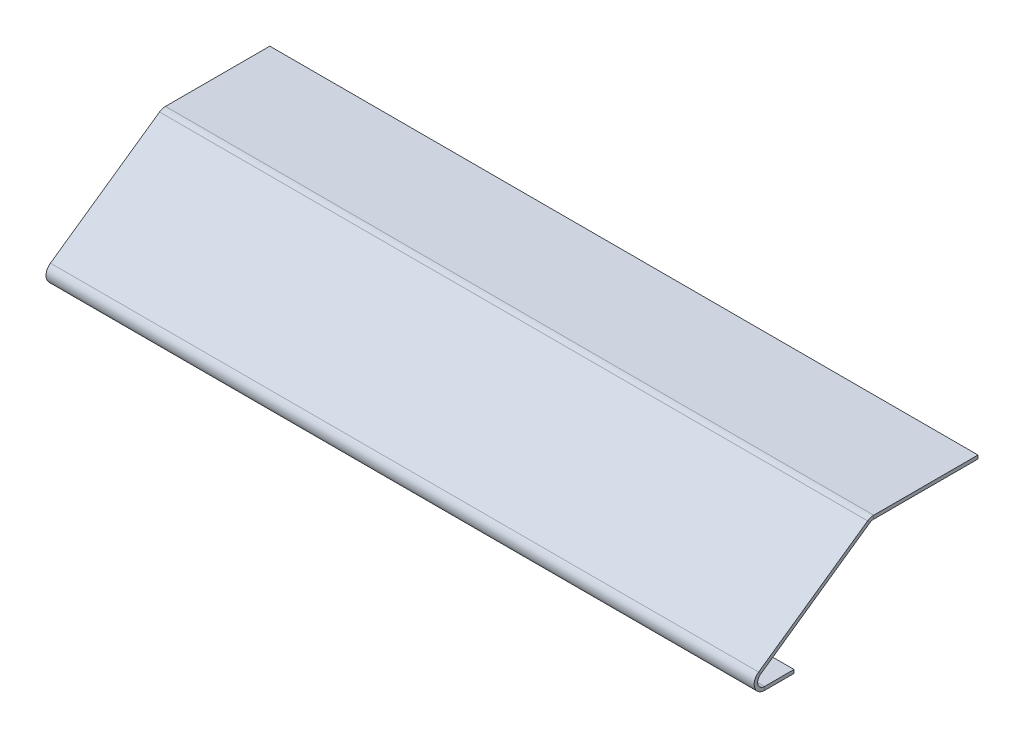
ISO-10303-21;
HEADER;
FILE_DESCRIPTION(('STEP AP214'),'2;1');
FILE_NAME('part.step','',(''),(''),'','','');
FILE_SCHEMA(('AUTOMOTIVE_DESIGN { 1 0 10303 214 1 1 1 1 }'));
ENDSEC;
DATA;
#1=APPLICATION_CONTEXT('core data for automotive mechanical design processes');
#2=APPLICATION_PROTOCOL_DEFINITION('international standard','automotive_design',2000,#1);
#3=PRODUCT_CONTEXT('',#1,'mechanical');
#4=PRODUCT('Part','Part','',(#3));
#5=PRODUCT_RELATED_PRODUCT_CATEGORY('part','',(#4));
#6=PRODUCT_DEFINITION_FORMATION('','',#4);
#7=PRODUCT_DEFINITION_CONTEXT('part definition',#1,'design');
#8=PRODUCT_DEFINITION('design','',#6,#7);
#9=PRODUCT_DEFINITION_SHAPE('','',#8);
#10=(LENGTH_UNIT() NAMED_UNIT(*) SI_UNIT(.MILLI.,.METRE.));
#11=(NAMED_UNIT(*) PLANE_ANGLE_UNIT() SI_UNIT($,.RADIAN.));
#12=(NAMED_UNIT(*) SI_UNIT($,.STERADIAN.) SOLID_ANGLE_UNIT());
#13=UNCERTAINTY_MEASURE_WITH_UNIT(LENGTH_MEASURE(1.E-05),#10,'distance_accuracy_value','');
#14=(GEOMETRIC_REPRESENTATION_CONTEXT(3) GLOBAL_UNCERTAINTY_ASSIGNED_CONTEXT((#13)) GLOBAL_UNIT_ASSIGNED_CONTEXT((#10,
#11,#12)) REPRESENTATION_CONTEXT('',''));
#15=CARTESIAN_POINT('',(0.,0.,0.));
#16=DIRECTION('',(0.,0.,1.));
#17=DIRECTION('',(1.,0.,0.));
#18=AXIS2_PLACEMENT_3D('',#15,#16,#17);
#19=CARTESIAN_POINT('',(647.7,17.3274232218526,32.3662327717342));
#20=DIRECTION('',(1.,0.,0.));
#21=DIRECTION('',(0.,0.,-1.));
#22=AXIS2_PLACEMENT_3D('',#19,#20,#21);
#23=PLANE('',#22);
#24=DIRECTION('',(0.,-0.819152044288989,-0.57357643635105));
#25=VECTOR('',#24,1.);
#26=CARTESIAN_POINT('',(647.7,17.3274232218526,32.3662327717342));
#27=LINE('',#26,#25);
#28=CARTESIAN_POINT('',(647.7,17.3274232218526,32.3662327717342));
#29=VERTEX_POINT('',#28);
#30=CARTESIAN_POINT('',(647.7,14.7266154812351,30.5451275863196));
#31=VERTEX_POINT('',#30);
#32=EDGE_CURVE('E11',#29,#31,#27,.T.);
#33=ORIENTED_EDGE('',*,*,#32,.F.);
#34=CARTESIAN_POINT('',(647.7,9.52500000000001,26.9029172154904));
#35=DIRECTION('',(1.,0.,0.));
#36=DIRECTION('',(0.,0.,-1.));
#37=AXIS2_PLACEMENT_3D('',#34,#35,#36);
#38=CIRCLE('',#37,9.525);
#39=CARTESIAN_POINT('',(647.7,0.,26.9029172154904));
#40=VERTEX_POINT('',#39);
#41=EDGE_CURVE('E246',#40,#29,#38,.F.);
#42=ORIENTED_EDGE('',*,*,#41,.F.);
#43=DIRECTION('',(0.,-1.,0.));
#44=VECTOR('',#43,1.);
#45=CARTESIAN_POINT('',(647.7,3.17500000000001,26.9029172154904));
#46=LINE('',#45,#44);
#47=CARTESIAN_POINT('',(647.7,3.17500000000001,26.9029172154904));
#48=VERTEX_POINT('',#47);
#49=EDGE_CURVE('E44',#48,#40,#46,.T.);
#50=ORIENTED_EDGE('',*,*,#49,.F.);
#51=CARTESIAN_POINT('',(647.7,9.52500000000001,26.9029172154904));
#52=DIRECTION('',(1.,0.,0.));
#53=DIRECTION('',(0.,0.,-1.));
#54=AXIS2_PLACEMENT_3D('',#51,#52,#53);
#55=CIRCLE('',#54,6.35);
#56=EDGE_CURVE('E145',#48,#31,#55,.F.);
#57=ORIENTED_EDGE('',*,*,#56,.T.);
#58=EDGE_LOOP('',(#33,#42,#50,#57));
#59=FACE_BOUND('',#58,.T.);
#60=ADVANCED_FACE('F36',(#59),#23,.T.);
#61=CARTESIAN_POINT('',(647.7,3.17500000000001,26.9029172154904));
#62=DIRECTION('',(1.,0.,0.));
#63=DIRECTION('',(0.,0.,-1.));
#64=AXIS2_PLACEMENT_3D('',#61,#62,#63);
#65=PLANE('',#64);
#66=DIRECTION('',(0.,0.573576436351047,-0.819152044288991));
#67=VECTOR('',#66,1.);
#68=CARTESIAN_POINT('',(647.7,0.,57.112357708));
#69=LINE('',#68,#67);
#70=CARTESIAN_POINT('',(647.7,87.1774232218525,-67.3899054992022));
#71=VERTEX_POINT('',#70);
#72=EDGE_CURVE('E139',#29,#71,#69,.T.);
#73=ORIENTED_EDGE('',*,*,#72,.F.);
#74=ORIENTED_EDGE('',*,*,#32,.T.);
#75=DIRECTION('',(0.,0.573576436351047,-0.819152044288991));
#76=VECTOR('',#75,1.);
#77=CARTESIAN_POINT('',(647.7,-2.60080774061755,55.2912525225854));
#78=LINE('',#77,#76);
#79=CARTESIAN_POINT('',(647.7,84.576615481235,-69.2110106846167));
#80=VERTEX_POINT('',#79);
#81=EDGE_CURVE('E136',#31,#80,#78,.T.);
#82=ORIENTED_EDGE('',*,*,#81,.T.);
#83=DIRECTION('',(0.,0.819152044288986,0.573576436351054));
#84=VECTOR('',#83,1.);
#85=CARTESIAN_POINT('',(647.7,84.576615481235,-69.2110106846167));
#86=LINE('',#85,#84);
#87=EDGE_CURVE('E227',#80,#71,#86,.T.);
#88=ORIENTED_EDGE('',*,*,#87,.T.);
#89=EDGE_LOOP('',(#73,#74,#82,#88));
#90=FACE_BOUND('',#89,.T.);
#91=ADVANCED_FACE('F134',(#90),#65,.T.);
#92=CARTESIAN_POINT('',(0.,0.,26.9029172154904));
#93=DIRECTION('',(-1.,0.,0.));
#94=DIRECTION('',(0.,0.,1.));
#95=AXIS2_PLACEMENT_3D('',#92,#93,#94);
#96=PLANE('',#95);
#97=DIRECTION('',(0.,1.,0.));
#98=VECTOR('',#97,1.);
#99=CARTESIAN_POINT('',(0.,0.,26.9029172154904));
#100=LINE('',#99,#98);
#101=CARTESIAN_POINT('',(0.,0.,26.9029172154904));
#102=VERTEX_POINT('',#101);
#103=CARTESIAN_POINT('',(0.,3.17500000000001,26.9029172154904));
#104=VERTEX_POINT('',#103);
#105=EDGE_CURVE('E232',#102,#104,#100,.T.);
#106=ORIENTED_EDGE('',*,*,#105,.F.);
#107=CARTESIAN_POINT('',(0.,9.52500000000001,26.9029172154904));
#108=DIRECTION('',(1.,0.,0.));
#109=DIRECTION('',(0.,0.,-1.));
#110=AXIS2_PLACEMENT_3D('',#107,#108,#109);
#111=CIRCLE('',#110,9.525);
#112=CARTESIAN_POINT('',(0.,17.3274232218526,32.3662327717342));
#113=VERTEX_POINT('',#112);
#114=EDGE_CURVE('E184',#102,#113,#111,.F.);
#115=ORIENTED_EDGE('',*,*,#114,.T.);
#116=DIRECTION('',(0.,0.819152044288989,0.57357643635105));
#117=VECTOR('',#116,1.);
#118=CARTESIAN_POINT('',(0.,14.7266154812351,30.5451275863196));
#119=LINE('',#118,#117);
#120=CARTESIAN_POINT('',(0.,14.7266154812351,30.5451275863196));
#121=VERTEX_POINT('',#120);
#122=EDGE_CURVE('E230',#121,#113,#119,.T.);
#123=ORIENTED_EDGE('',*,*,#122,.F.);
#124=CARTESIAN_POINT('',(0.,9.52500000000001,26.9029172154904));
#125=DIRECTION('',(1.,0.,0.));
#126=DIRECTION('',(0.,0.,-1.));
#127=AXIS2_PLACEMENT_3D('',#124,#125,#126);
#128=CIRCLE('',#127,6.35);
#129=EDGE_CURVE('E157',#104,#121,#128,.F.);
#130=ORIENTED_EDGE('',*,*,#129,.F.);
#131=EDGE_LOOP('',(#106,#115,#123,#130));
#132=FACE_BOUND('',#131,.T.);
#133=ADVANCED_FACE('F284',(#132),#96,.T.);
#134=CARTESIAN_POINT('',(0.,14.7266154812351,30.5451275863196));
#135=DIRECTION('',(-1.,0.,0.));
#136=DIRECTION('',(0.,0.,1.));
#137=AXIS2_PLACEMENT_3D('',#134,#135,#136);
#138=PLANE('',#137);
#139=DIRECTION('',(0.,0.,1.));
#140=VECTOR('',#139,1.);
#141=CARTESIAN_POINT('',(0.,0.,0.));
#142=LINE('',#141,#140);
#143=CARTESIAN_POINT('',(0.,0.,0.));
#144=VERTEX_POINT('',#143);
#145=EDGE_CURVE('E187',#144,#102,#142,.T.);
#146=ORIENTED_EDGE('',*,*,#145,.T.);
#147=ORIENTED_EDGE('',*,*,#105,.T.);
#148=DIRECTION('',(0.,0.,1.));
#149=VECTOR('',#148,1.);
#150=CARTESIAN_POINT('',(0.,3.175,0.));
#151=LINE('',#150,#149);
#152=CARTESIAN_POINT('',(0.,3.175,0.));
#153=VERTEX_POINT('',#152);
#154=EDGE_CURVE('E193',#153,#104,#151,.T.);
#155=ORIENTED_EDGE('',*,*,#154,.F.);
#156=DIRECTION('',(0.,-1.,0.));
#157=VECTOR('',#156,1.);
#158=CARTESIAN_POINT('',(0.,3.175,0.));
#159=LINE('',#158,#157);
#160=EDGE_CURVE('E190',#153,#144,#159,.T.);
#161=ORIENTED_EDGE('',*,*,#160,.T.);
#162=EDGE_LOOP('',(#146,#147,#155,#161));
#163=FACE_BOUND('',#162,.T.);
#164=ADVANCED_FACE('F287',(#163),#138,.T.);
#165=CARTESIAN_POINT('',(647.7,88.9,-72.8532210554459));
#166=DIRECTION('',(1.,0.,0.));
#167=DIRECTION('',(0.,0.,-1.));
#168=AXIS2_PLACEMENT_3D('',#165,#166,#167);
#169=PLANE('',#168);
#170=DIRECTION('',(0.,-1.,0.));
#171=VECTOR('',#170,1.);
#172=CARTESIAN_POINT('',(647.7,88.9,-72.8532210554459));
#173=LINE('',#172,#171);
#174=CARTESIAN_POINT('',(647.7,88.9,-72.8532210554459));
#175=VERTEX_POINT('',#174);
#176=CARTESIAN_POINT('',(647.7,85.725,-72.8532210554459));
#177=VERTEX_POINT('',#176);
#178=EDGE_CURVE('E52',#175,#177,#173,.T.);
#179=ORIENTED_EDGE('',*,*,#178,.F.);
#180=CARTESIAN_POINT('',(647.7,79.375,-72.8532210554459));
#181=DIRECTION('',(1.,0.,0.));
#182=DIRECTION('',(0.,0.,-1.));
#183=AXIS2_PLACEMENT_3D('',#180,#181,#182);
#184=CIRCLE('',#183,9.525);
#185=EDGE_CURVE('E256',#71,#175,#184,.F.);
#186=ORIENTED_EDGE('',*,*,#185,.F.);
#187=ORIENTED_EDGE('',*,*,#87,.F.);
#188=CARTESIAN_POINT('',(647.7,79.375,-72.8532210554459));
#189=DIRECTION('',(1.,0.,0.));
#190=DIRECTION('',(0.,0.,-1.));
#191=AXIS2_PLACEMENT_3D('',#188,#189,#190);
#192=CIRCLE('',#191,6.35);
#193=EDGE_CURVE('E165',#80,#177,#192,.F.);
#194=ORIENTED_EDGE('',*,*,#193,.T.);
#195=EDGE_LOOP('',(#179,#186,#187,#194));
#196=FACE_BOUND('',#195,.T.);
#197=ADVANCED_FACE('F279',(#196),#169,.T.);
#198=CARTESIAN_POINT('',(647.7,84.576615481235,-69.2110106846167));
#199=DIRECTION('',(1.,0.,0.));
#200=DIRECTION('',(0.,0.,-1.));
#201=AXIS2_PLACEMENT_3D('',#198,#199,#200);
#202=PLANE('',#201);
#203=DIRECTION('',(0.,0.,-1.));
#204=VECTOR('',#203,1.);
#205=CARTESIAN_POINT('',(647.7,88.9,-69.8500000913737));
#206=LINE('',#205,#204);
#207=CARTESIAN_POINT('',(647.7,88.9,-168.275000091374));
#208=VERTEX_POINT('',#207);
#209=EDGE_CURVE('E259',#175,#208,#206,.T.);
#210=ORIENTED_EDGE('',*,*,#209,.F.);
#211=ORIENTED_EDGE('',*,*,#178,.T.);
#212=DIRECTION('',(0.,0.,-1.));
#213=VECTOR('',#212,1.);
#214=CARTESIAN_POINT('',(647.7,85.725,-69.8500000913737));
#215=LINE('',#214,#213);
#216=CARTESIAN_POINT('',(647.7,85.725,-168.275000091374));
#217=VERTEX_POINT('',#216);
#218=EDGE_CURVE('E106',#177,#217,#215,.T.);
#219=ORIENTED_EDGE('',*,*,#218,.T.);
#220=DIRECTION('',(0.,-1.,0.));
#221=VECTOR('',#220,1.);
#222=CARTESIAN_POINT('',(647.7,88.9,-168.275000091374));
#223=LINE('',#222,#221);
#224=EDGE_CURVE('E262',#208,#217,#223,.T.);
#225=ORIENTED_EDGE('',*,*,#224,.F.);
#226=EDGE_LOOP('',(#210,#211,#219,#225));
#227=FACE_BOUND('',#226,.T.);
#228=ADVANCED_FACE('F268',(#227),#202,.T.);
#229=CARTESIAN_POINT('',(0.,87.1774232218525,-67.3899054992022));
#230=DIRECTION('',(-1.,0.,0.));
#231=DIRECTION('',(0.,0.,1.));
#232=AXIS2_PLACEMENT_3D('',#229,#230,#231);
#233=PLANE('',#232);
#234=DIRECTION('',(0.,-0.819152044288986,-0.573576436351054));
#235=VECTOR('',#234,1.);
#236=CARTESIAN_POINT('',(0.,87.1774232218525,-67.3899054992022));
#237=LINE('',#236,#235);
#238=CARTESIAN_POINT('',(0.,87.1774232218525,-67.3899054992022));
#239=VERTEX_POINT('',#238);
#240=CARTESIAN_POINT('',(0.,84.576615481235,-69.2110106846167));
#241=VERTEX_POINT('',#240);
#242=EDGE_CURVE('E93',#239,#241,#237,.T.);
#243=ORIENTED_EDGE('',*,*,#242,.F.);
#244=CARTESIAN_POINT('',(0.,79.375,-72.8532210554459));
#245=DIRECTION('',(1.,0.,0.));
#246=DIRECTION('',(0.,0.,-1.));
#247=AXIS2_PLACEMENT_3D('',#244,#245,#246);
#248=CIRCLE('',#247,9.525);
#249=CARTESIAN_POINT('',(0.,88.9,-72.8532210554459));
#250=VERTEX_POINT('',#249);
#251=EDGE_CURVE('E180',#239,#250,#248,.F.);
#252=ORIENTED_EDGE('',*,*,#251,.T.);
#253=DIRECTION('',(0.,1.,0.));
#254=VECTOR('',#253,1.);
#255=CARTESIAN_POINT('',(0.,85.725,-72.8532210554459));
#256=LINE('',#255,#254);
#257=CARTESIAN_POINT('',(0.,85.725,-72.8532210554459));
#258=VERTEX_POINT('',#257);
#259=EDGE_CURVE('E100',#258,#250,#256,.T.);
#260=ORIENTED_EDGE('',*,*,#259,.F.);
#261=CARTESIAN_POINT('',(0.,79.375,-72.8532210554459));
#262=DIRECTION('',(1.,0.,0.));
#263=DIRECTION('',(0.,0.,-1.));
#264=AXIS2_PLACEMENT_3D('',#261,#262,#263);
#265=CIRCLE('',#264,6.35);
#266=EDGE_CURVE('E199',#241,#258,#265,.F.);
#267=ORIENTED_EDGE('',*,*,#266,.F.);
#268=EDGE_LOOP('',(#243,#252,#260,#267));
#269=FACE_BOUND('',#268,.T.);
#270=ADVANCED_FACE('F316',(#269),#233,.T.);
#271=CARTESIAN_POINT('',(0.,85.725,-72.8532210554459));
#272=DIRECTION('',(-1.,0.,0.));
#273=DIRECTION('',(0.,0.,1.));
#274=AXIS2_PLACEMENT_3D('',#271,#272,#273);
#275=PLANE('',#274);
#276=DIRECTION('',(0.,0.573576436351047,-0.819152044288991));
#277=VECTOR('',#276,1.);
#278=CARTESIAN_POINT('',(0.,0.,57.112357708));
#279=LINE('',#278,#277);
#280=EDGE_CURVE('E182',#113,#239,#279,.T.);
#281=ORIENTED_EDGE('',*,*,#280,.T.);
#282=ORIENTED_EDGE('',*,*,#242,.T.);
#283=DIRECTION('',(0.,0.573576436351047,-0.819152044288991));
#284=VECTOR('',#283,1.);
#285=CARTESIAN_POINT('',(0.,-2.60080774061755,55.2912525225854));
#286=LINE('',#285,#284);
#287=EDGE_CURVE('E197',#121,#241,#286,.T.);
#288=ORIENTED_EDGE('',*,*,#287,.F.);
#289=ORIENTED_EDGE('',*,*,#122,.T.);
#290=EDGE_LOOP('',(#281,#282,#288,#289));
#291=FACE_BOUND('',#290,.T.);
#292=ADVANCED_FACE('F319',(#291),#275,.T.);
#293=CARTESIAN_POINT('',(647.7,85.725,-69.8500000913737));
#294=DIRECTION('',(0.,1.,0.));
#295=DIRECTION('',(0.,0.,1.));
#296=AXIS2_PLACEMENT_3D('',#293,#294,#295);
#297=PLANE('',#296);
#298=DIRECTION('',(0.,0.,-1.));
#299=VECTOR('',#298,1.);
#300=CARTESIAN_POINT('',(0.,85.725,-69.8500000913737));
#301=LINE('',#300,#299);
#302=CARTESIAN_POINT('',(0.,85.725,-168.275000091374));
#303=VERTEX_POINT('',#302);
#304=EDGE_CURVE('E171',#258,#303,#301,.T.);
#305=ORIENTED_EDGE('',*,*,#304,.T.);
#306=DIRECTION('',(-1.,0.,0.));
#307=VECTOR('',#306,1.);
#308=CARTESIAN_POINT('',(647.7,85.725,-168.275000091374));
#309=LINE('',#308,#307);
#310=EDGE_CURVE('E223',#217,#303,#309,.T.);
#311=ORIENTED_EDGE('',*,*,#310,.F.);
#312=ORIENTED_EDGE('',*,*,#218,.F.);
#313=DIRECTION('',(-1.,0.,0.));
#314=VECTOR('',#313,1.);
#315=CARTESIAN_POINT('',(647.7,85.725,-72.8532210554459));
#316=LINE('',#315,#314);
#317=EDGE_CURVE('E167',#177,#258,#316,.T.);
#318=ORIENTED_EDGE('',*,*,#317,.T.);
#319=EDGE_LOOP('',(#305,#311,#312,#318));
#320=FACE_BOUND('',#319,.T.);
#321=ADVANCED_FACE('F322',(#320),#297,.F.);
#322=CARTESIAN_POINT('',(647.7,88.9,-168.275000091374));
#323=DIRECTION('',(0.,0.,-1.));
#324=DIRECTION('',(-1.,0.,0.));
#325=AXIS2_PLACEMENT_3D('',#322,#323,#324);
#326=PLANE('',#325);
#327=DIRECTION('',(0.,-1.,0.));
#328=VECTOR('',#327,1.);
#329=CARTESIAN_POINT('',(0.,88.9,-168.275000091374));
#330=LINE('',#329,#328);
#331=CARTESIAN_POINT('',(0.,88.9,-168.275000091374));
#332=VERTEX_POINT('',#331);
#333=EDGE_CURVE('E174',#332,#303,#330,.T.);
#334=ORIENTED_EDGE('',*,*,#333,.F.);
#335=DIRECTION('',(-1.,0.,0.));
#336=VECTOR('',#335,1.);
#337=CARTESIAN_POINT('',(647.7,88.9,-168.275000091374));
#338=LINE('',#337,#336);
#339=EDGE_CURVE('E221',#208,#332,#338,.T.);
#340=ORIENTED_EDGE('',*,*,#339,.F.);
#341=ORIENTED_EDGE('',*,*,#224,.T.);
#342=ORIENTED_EDGE('',*,*,#310,.T.);
#343=EDGE_LOOP('',(#334,#340,#341,#342));
#344=FACE_BOUND('',#343,.T.);
#345=ADVANCED_FACE('F267',(#344),#326,.T.);
#346=CARTESIAN_POINT('',(647.7,88.9,-69.8500000913737));
#347=DIRECTION('',(0.,1.,0.));
#348=DIRECTION('',(0.,0.,1.));
#349=AXIS2_PLACEMENT_3D('',#346,#347,#348);
#350=PLANE('',#349);
#351=DIRECTION('',(0.,0.,-1.));
#352=VECTOR('',#351,1.);
#353=CARTESIAN_POINT('',(0.,88.9,-69.8500000913737));
#354=LINE('',#353,#352);
#355=EDGE_CURVE('E177',#250,#332,#354,.T.);
#356=ORIENTED_EDGE('',*,*,#355,.F.);
#357=DIRECTION('',(-1.,0.,0.));
#358=VECTOR('',#357,1.);
#359=CARTESIAN_POINT('',(647.7,88.9,-72.8532210554459));
#360=LINE('',#359,#358);
#361=EDGE_CURVE('E218',#175,#250,#360,.T.);
#362=ORIENTED_EDGE('',*,*,#361,.F.);
#363=ORIENTED_EDGE('',*,*,#209,.T.);
#364=ORIENTED_EDGE('',*,*,#339,.T.);
#365=EDGE_LOOP('',(#356,#362,#363,#364));
#366=FACE_BOUND('',#365,.T.);
#367=ADVANCED_FACE('F272',(#366),#350,.T.);
#368=CARTESIAN_POINT('',(647.7,79.375,-72.8532210554459));
#369=DIRECTION('',(-1.,0.,0.));
#370=DIRECTION('',(0.,0.,1.));
#371=AXIS2_PLACEMENT_3D('',#368,#369,#370);
#372=CYLINDRICAL_SURFACE('',#371,9.525);
#373=ORIENTED_EDGE('',*,*,#251,.F.);
#374=DIRECTION('',(-1.,0.,0.));
#375=VECTOR('',#374,1.);
#376=CARTESIAN_POINT('',(647.7,87.1774232218525,-67.3899054992022));
#377=LINE('',#376,#375);
#378=EDGE_CURVE('E215',#71,#239,#377,.T.);
#379=ORIENTED_EDGE('',*,*,#378,.F.);
#380=ORIENTED_EDGE('',*,*,#185,.T.);
#381=ORIENTED_EDGE('',*,*,#361,.T.);
#382=EDGE_LOOP('',(#373,#379,#380,#381));
#383=FACE_BOUND('',#382,.T.);
#384=ADVANCED_FACE('F275',(#383),#372,.T.);
#385=CARTESIAN_POINT('',(647.7,0.,57.112357708));
#386=DIRECTION('',(0.,0.819152044288991,0.573576436351047));
#387=DIRECTION('',(0.,-0.573576436351047,0.819152044288991));
#388=AXIS2_PLACEMENT_3D('',#385,#386,#387);
#389=PLANE('',#388);
#390=ORIENTED_EDGE('',*,*,#280,.F.);
#391=DIRECTION('',(-1.,0.,0.));
#392=VECTOR('',#391,1.);
#393=CARTESIAN_POINT('',(647.7,17.3274232218526,32.3662327717342));
#394=LINE('',#393,#392);
#395=EDGE_CURVE('E212',#29,#113,#394,.T.);
#396=ORIENTED_EDGE('',*,*,#395,.F.);
#397=ORIENTED_EDGE('',*,*,#72,.T.);
#398=ORIENTED_EDGE('',*,*,#378,.T.);
#399=EDGE_LOOP('',(#390,#396,#397,#398));
#400=FACE_BOUND('',#399,.T.);
#401=ADVANCED_FACE('F282',(#400),#389,.T.);
#402=CARTESIAN_POINT('',(647.7,9.52500000000001,26.9029172154904));
#403=DIRECTION('',(-1.,0.,0.));
#404=DIRECTION('',(0.,0.,1.));
#405=AXIS2_PLACEMENT_3D('',#402,#403,#404);
#406=CYLINDRICAL_SURFACE('',#405,9.525);
#407=ORIENTED_EDGE('',*,*,#114,.F.);
#408=DIRECTION('',(-1.,0.,0.));
#409=VECTOR('',#408,1.);
#410=CARTESIAN_POINT('',(647.7,0.,26.9029172154904));
#411=LINE('',#410,#409);
#412=EDGE_CURVE('E209',#40,#102,#411,.T.);
#413=ORIENTED_EDGE('',*,*,#412,.F.);
#414=ORIENTED_EDGE('',*,*,#41,.T.);
#415=ORIENTED_EDGE('',*,*,#395,.T.);
#416=EDGE_LOOP('',(#407,#413,#414,#415));
#417=FACE_BOUND('',#416,.T.);
#418=ADVANCED_FACE('F245',(#417),#406,.T.);
#419=CARTESIAN_POINT('',(647.7,0.,0.));
#420=DIRECTION('',(0.,-1.,0.));
#421=DIRECTION('',(0.,0.,-1.));
#422=AXIS2_PLACEMENT_3D('',#419,#420,#421);
#423=PLANE('',#422);
#424=ORIENTED_EDGE('',*,*,#145,.F.);
#425=DIRECTION('',(-1.,0.,0.));
#426=VECTOR('',#425,1.);
#427=CARTESIAN_POINT('',(647.7,0.,0.));
#428=LINE('',#427,#426);
#429=CARTESIAN_POINT('',(647.7,0.,0.));
#430=VERTEX_POINT('',#429);
#431=EDGE_CURVE('E207',#430,#144,#428,.T.);
#432=ORIENTED_EDGE('',*,*,#431,.F.);
#433=DIRECTION('',(0.,0.,1.));
#434=VECTOR('',#433,1.);
#435=CARTESIAN_POINT('',(647.7,0.,0.));
#436=LINE('',#435,#434);
#437=EDGE_CURVE('E239',#430,#40,#436,.T.);
#438=ORIENTED_EDGE('',*,*,#437,.T.);
#439=ORIENTED_EDGE('',*,*,#412,.T.);
#440=EDGE_LOOP('',(#424,#432,#438,#439));
#441=FACE_BOUND('',#440,.T.);
#442=ADVANCED_FACE('F250',(#441),#423,.T.);
#443=CARTESIAN_POINT('',(647.7,3.175,0.));
#444=DIRECTION('',(0.,0.,-1.));
#445=DIRECTION('',(0.,1.,0.));
#446=AXIS2_PLACEMENT_3D('',#443,#444,#445);
#447=PLANE('',#446);
#448=ORIENTED_EDGE('',*,*,#160,.F.);
#449=DIRECTION('',(-1.,0.,0.));
#450=VECTOR('',#449,1.);
#451=CARTESIAN_POINT('',(647.7,3.175,0.));
#452=LINE('',#451,#450);
#453=CARTESIAN_POINT('',(647.7,3.175,0.));
#454=VERTEX_POINT('',#453);
#455=EDGE_CURVE('E205',#454,#153,#452,.T.);
#456=ORIENTED_EDGE('',*,*,#455,.F.);
#457=DIRECTION('',(0.,-1.,0.));
#458=VECTOR('',#457,1.);
#459=CARTESIAN_POINT('',(647.7,3.175,0.));
#460=LINE('',#459,#458);
#461=EDGE_CURVE('E251',#454,#430,#460,.T.);
#462=ORIENTED_EDGE('',*,*,#461,.T.);
#463=ORIENTED_EDGE('',*,*,#431,.T.);
#464=EDGE_LOOP('',(#448,#456,#462,#463));
#465=FACE_BOUND('',#464,.T.);
#466=ADVANCED_FACE('F292',(#465),#447,.T.);
#467=CARTESIAN_POINT('',(647.7,3.175,0.));
#468=DIRECTION('',(0.,-1.,0.));
#469=DIRECTION('',(0.,0.,-1.));
#470=AXIS2_PLACEMENT_3D('',#467,#468,#469);
#471=PLANE('',#470);
#472=ORIENTED_EDGE('',*,*,#154,.T.);
#473=DIRECTION('',(-1.,0.,0.));
#474=VECTOR('',#473,1.);
#475=CARTESIAN_POINT('',(647.7,3.17500000000001,26.9029172154904));
#476=LINE('',#475,#474);
#477=EDGE_CURVE('E159',#48,#104,#476,.T.);
#478=ORIENTED_EDGE('',*,*,#477,.F.);
#479=DIRECTION('',(0.,0.,1.));
#480=VECTOR('',#479,1.);
#481=CARTESIAN_POINT('',(647.7,3.175,0.));
#482=LINE('',#481,#480);
#483=EDGE_CURVE('E150',#454,#48,#482,.T.);
#484=ORIENTED_EDGE('',*,*,#483,.F.);
#485=ORIENTED_EDGE('',*,*,#455,.T.);
#486=EDGE_LOOP('',(#472,#478,#484,#485));
#487=FACE_BOUND('',#486,.T.);
#488=ADVANCED_FACE('F290',(#487),#471,.F.);
#489=CARTESIAN_POINT('',(647.7,9.52500000000001,26.9029172154904));
#490=DIRECTION('',(-1.,0.,0.));
#491=DIRECTION('',(0.,0.,1.));
#492=AXIS2_PLACEMENT_3D('',#489,#490,#491);
#493=CYLINDRICAL_SURFACE('',#492,6.35);
#494=ORIENTED_EDGE('',*,*,#129,.T.);
#495=DIRECTION('',(-1.,0.,0.));
#496=VECTOR('',#495,1.);
#497=CARTESIAN_POINT('',(647.7,14.7266154812351,30.5451275863196));
#498=LINE('',#497,#496);
#499=EDGE_CURVE('E154',#31,#121,#498,.T.);
#500=ORIENTED_EDGE('',*,*,#499,.F.);
#501=ORIENTED_EDGE('',*,*,#56,.F.);
#502=ORIENTED_EDGE('',*,*,#477,.T.);
#503=EDGE_LOOP('',(#494,#500,#501,#502));
#504=FACE_BOUND('',#503,.T.);
#505=ADVANCED_FACE('F155',(#504),#493,.F.);
#506=CARTESIAN_POINT('',(647.7,-2.60080774061755,55.2912525225854));
#507=DIRECTION('',(0.,0.819152044288991,0.573576436351047));
#508=DIRECTION('',(0.,-0.573576436351047,0.819152044288991));
#509=AXIS2_PLACEMENT_3D('',#506,#507,#508);
#510=PLANE('',#509);
#511=ORIENTED_EDGE('',*,*,#287,.T.);
#512=DIRECTION('',(-1.,0.,0.));
#513=VECTOR('',#512,1.);
#514=CARTESIAN_POINT('',(647.7,84.576615481235,-69.2110106846167));
#515=LINE('',#514,#513);
#516=EDGE_CURVE('E160',#80,#241,#515,.T.);
#517=ORIENTED_EDGE('',*,*,#516,.F.);
#518=ORIENTED_EDGE('',*,*,#81,.F.);
#519=ORIENTED_EDGE('',*,*,#499,.T.);
#520=EDGE_LOOP('',(#511,#517,#518,#519));
#521=FACE_BOUND('',#520,.T.);
#522=ADVANCED_FACE('F162',(#521),#510,.F.);
#523=CARTESIAN_POINT('',(647.7,79.375,-72.8532210554459));
#524=DIRECTION('',(-1.,0.,0.));
#525=DIRECTION('',(0.,0.,1.));
#526=AXIS2_PLACEMENT_3D('',#523,#524,#525);
#527=CYLINDRICAL_SURFACE('',#526,6.35);
#528=ORIENTED_EDGE('',*,*,#266,.T.);
#529=ORIENTED_EDGE('',*,*,#317,.F.);
#530=ORIENTED_EDGE('',*,*,#193,.F.);
#531=ORIENTED_EDGE('',*,*,#516,.T.);
#532=EDGE_LOOP('',(#528,#529,#530,#531));
#533=FACE_BOUND('',#532,.T.);
#534=ADVANCED_FACE('F374',(#533),#527,.F.);
#535=CARTESIAN_POINT('',(647.7,79.375,-72.8532210554459));
#536=DIRECTION('',(1.,0.,0.));
#537=DIRECTION('',(0.,0.,-1.));
#538=AXIS2_PLACEMENT_3D('',#535,#536,#537);
#539=PLANE('',#538);
#540=ORIENTED_EDGE('',*,*,#483,.T.);
#541=ORIENTED_EDGE('',*,*,#49,.T.);
#542=ORIENTED_EDGE('',*,*,#437,.F.);
#543=ORIENTED_EDGE('',*,*,#461,.F.);
#544=EDGE_LOOP('',(#540,#541,#542,#543));
#545=FACE_BOUND('',#544,.T.);
#546=ADVANCED_FACE('F236',(#545),#539,.T.);
#547=CARTESIAN_POINT('',(0.,79.375,-72.8532210554459));
#548=DIRECTION('',(1.,0.,0.));
#549=DIRECTION('',(0.,0.,-1.));
#550=AXIS2_PLACEMENT_3D('',#547,#548,#549);
#551=PLANE('',#550);
#552=ORIENTED_EDGE('',*,*,#304,.F.);
#553=ORIENTED_EDGE('',*,*,#259,.T.);
#554=ORIENTED_EDGE('',*,*,#355,.T.);
#555=ORIENTED_EDGE('',*,*,#333,.T.);
#556=EDGE_LOOP('',(#552,#553,#554,#555));
#557=FACE_BOUND('',#556,.T.);
#558=ADVANCED_FACE('F394',(#557),#551,.F.);
#559=CLOSED_SHELL('',(#60,#91,#133,#164,#197,#228,#270,#292,#321,#345,#367,#384,#401,#418,#442,
#466,#488,#505,#522,#534,#546,#558));
#560=MANIFOLD_SOLID_BREP('B2',#559);
#561=ADVANCED_BREP_SHAPE_REPRESENTATION('',(#18,#560),#14);
#562=SHAPE_DEFINITION_REPRESENTATION(#9,#561);
ENDSEC;
END-ISO-10303-21;
